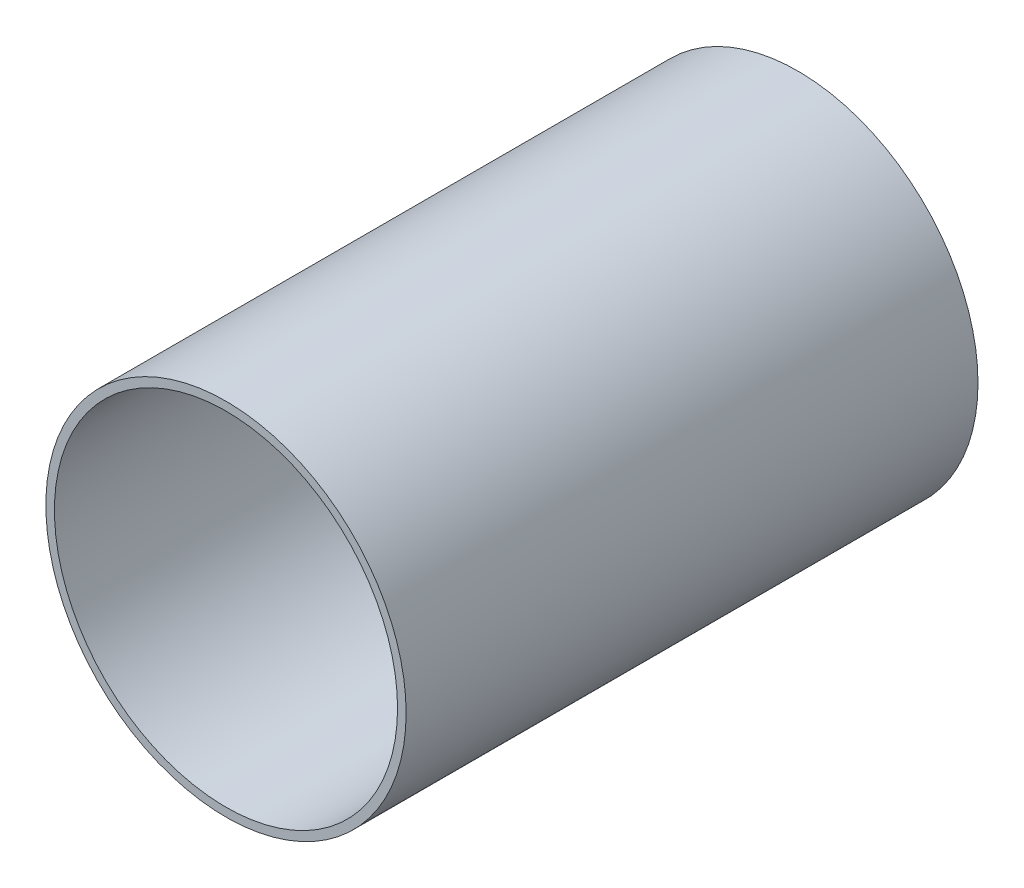
ISO-10303-21;
HEADER;
FILE_DESCRIPTION(('STEP AP214'),'2;1');
FILE_NAME('part.step','',(''),(''),'','','');
FILE_SCHEMA(('AUTOMOTIVE_DESIGN { 1 0 10303 214 1 1 1 1 }'));
ENDSEC;
DATA;
#1=APPLICATION_CONTEXT('core data for automotive mechanical design processes');
#2=APPLICATION_PROTOCOL_DEFINITION('international standard','automotive_design',2000,#1);
#3=PRODUCT_CONTEXT('',#1,'mechanical');
#4=PRODUCT('Part','Part','',(#3));
#5=PRODUCT_RELATED_PRODUCT_CATEGORY('part','',(#4));
#6=PRODUCT_DEFINITION_FORMATION('','',#4);
#7=PRODUCT_DEFINITION_CONTEXT('part definition',#1,'design');
#8=PRODUCT_DEFINITION('design','',#6,#7);
#9=PRODUCT_DEFINITION_SHAPE('','',#8);
#10=(LENGTH_UNIT() NAMED_UNIT(*) SI_UNIT(.MILLI.,.METRE.));
#11=(NAMED_UNIT(*) PLANE_ANGLE_UNIT() SI_UNIT($,.RADIAN.));
#12=(NAMED_UNIT(*) SI_UNIT($,.STERADIAN.) SOLID_ANGLE_UNIT());
#13=UNCERTAINTY_MEASURE_WITH_UNIT(LENGTH_MEASURE(1.E-05),#10,'distance_accuracy_value','');
#14=(GEOMETRIC_REPRESENTATION_CONTEXT(3) GLOBAL_UNCERTAINTY_ASSIGNED_CONTEXT((#13)) GLOBAL_UNIT_ASSIGNED_CONTEXT((#10,
#11,#12)) REPRESENTATION_CONTEXT('',''));
#15=CARTESIAN_POINT('',(0.,0.,0.));
#16=DIRECTION('',(0.,0.,1.));
#17=DIRECTION('',(1.,0.,0.));
#18=AXIS2_PLACEMENT_3D('',#15,#16,#17);
#19=CARTESIAN_POINT('',(0.,0.,100.));
#20=DIRECTION('',(0.,0.,1.));
#21=DIRECTION('',(1.,0.,0.));
#22=AXIS2_PLACEMENT_3D('',#19,#20,#21);
#23=PLANE('',#22);
#24=CARTESIAN_POINT('',(0.,0.,100.));
#25=DIRECTION('',(0.,0.,1.));
#26=DIRECTION('',(1.,0.,0.));
#27=AXIS2_PLACEMENT_3D('',#24,#25,#26);
#28=CIRCLE('',#27,31.5);
#29=CARTESIAN_POINT('',(31.5,0.,100.));
#30=VERTEX_POINT('',#29);
#31=EDGE_CURVE('E10',#30,#30,#28,.T.);
#32=ORIENTED_EDGE('',*,*,#31,.T.);
#33=EDGE_LOOP('',(#32));
#34=FACE_BOUND('',#33,.T.);
#35=CARTESIAN_POINT('',(0.,0.,100.));
#36=DIRECTION('',(0.,0.,1.));
#37=DIRECTION('',(1.,0.,0.));
#38=AXIS2_PLACEMENT_3D('',#35,#36,#37);
#39=CIRCLE('',#38,30.);
#40=CARTESIAN_POINT('',(30.,0.,100.));
#41=VERTEX_POINT('',#40);
#42=EDGE_CURVE('E41',#41,#41,#39,.T.);
#43=ORIENTED_EDGE('',*,*,#42,.F.);
#44=EDGE_LOOP('',(#43));
#45=FACE_BOUND('',#44,.T.);
#46=ADVANCED_FACE('F30',(#34,#45),#23,.T.);
#47=CARTESIAN_POINT('',(0.,0.,0.));
#48=DIRECTION('',(0.,0.,1.));
#49=DIRECTION('',(1.,0.,0.));
#50=AXIS2_PLACEMENT_3D('',#47,#48,#49);
#51=PLANE('',#50);
#52=CARTESIAN_POINT('',(0.,0.,0.));
#53=DIRECTION('',(0.,0.,1.));
#54=DIRECTION('',(1.,0.,0.));
#55=AXIS2_PLACEMENT_3D('',#52,#53,#54);
#56=CIRCLE('',#55,31.5);
#57=CARTESIAN_POINT('',(31.5,0.,0.));
#58=VERTEX_POINT('',#57);
#59=EDGE_CURVE('E34',#58,#58,#56,.T.);
#60=ORIENTED_EDGE('',*,*,#59,.F.);
#61=EDGE_LOOP('',(#60));
#62=FACE_BOUND('',#61,.T.);
#63=CARTESIAN_POINT('',(0.,0.,0.));
#64=DIRECTION('',(0.,0.,1.));
#65=DIRECTION('',(1.,0.,0.));
#66=AXIS2_PLACEMENT_3D('',#63,#64,#65);
#67=CIRCLE('',#66,30.);
#68=CARTESIAN_POINT('',(30.,0.,0.));
#69=VERTEX_POINT('',#68);
#70=EDGE_CURVE('E43',#69,#69,#67,.T.);
#71=ORIENTED_EDGE('',*,*,#70,.T.);
#72=EDGE_LOOP('',(#71));
#73=FACE_BOUND('',#72,.T.);
#74=ADVANCED_FACE('F53',(#62,#73),#51,.F.);
#75=CARTESIAN_POINT('',(0.,0.,100.));
#76=DIRECTION('',(0.,0.,-1.));
#77=DIRECTION('',(-1.,0.,0.));
#78=AXIS2_PLACEMENT_3D('',#75,#76,#77);
#79=CYLINDRICAL_SURFACE('',#78,31.5);
#80=ORIENTED_EDGE('',*,*,#31,.F.);
#81=EDGE_LOOP('',(#80));
#82=FACE_BOUND('',#81,.T.);
#83=ORIENTED_EDGE('',*,*,#59,.T.);
#84=EDGE_LOOP('',(#83));
#85=FACE_BOUND('',#84,.T.);
#86=ADVANCED_FACE('F32',(#82,#85),#79,.T.);
#87=CARTESIAN_POINT('',(0.,0.,100.));
#88=DIRECTION('',(0.,0.,-1.));
#89=DIRECTION('',(-1.,0.,0.));
#90=AXIS2_PLACEMENT_3D('',#87,#88,#89);
#91=CYLINDRICAL_SURFACE('',#90,30.);
#92=ORIENTED_EDGE('',*,*,#42,.T.);
#93=EDGE_LOOP('',(#92));
#94=FACE_BOUND('',#93,.T.);
#95=ORIENTED_EDGE('',*,*,#70,.F.);
#96=EDGE_LOOP('',(#95));
#97=FACE_BOUND('',#96,.T.);
#98=ADVANCED_FACE('F49',(#94,#97),#91,.F.);
#99=CLOSED_SHELL('',(#46,#74,#86,#98));
#100=MANIFOLD_SOLID_BREP('B2',#99);
#101=ADVANCED_BREP_SHAPE_REPRESENTATION('',(#18,#100),#14);
#102=SHAPE_DEFINITION_REPRESENTATION(#9,#101);
ENDSEC;
END-ISO-10303-21;
